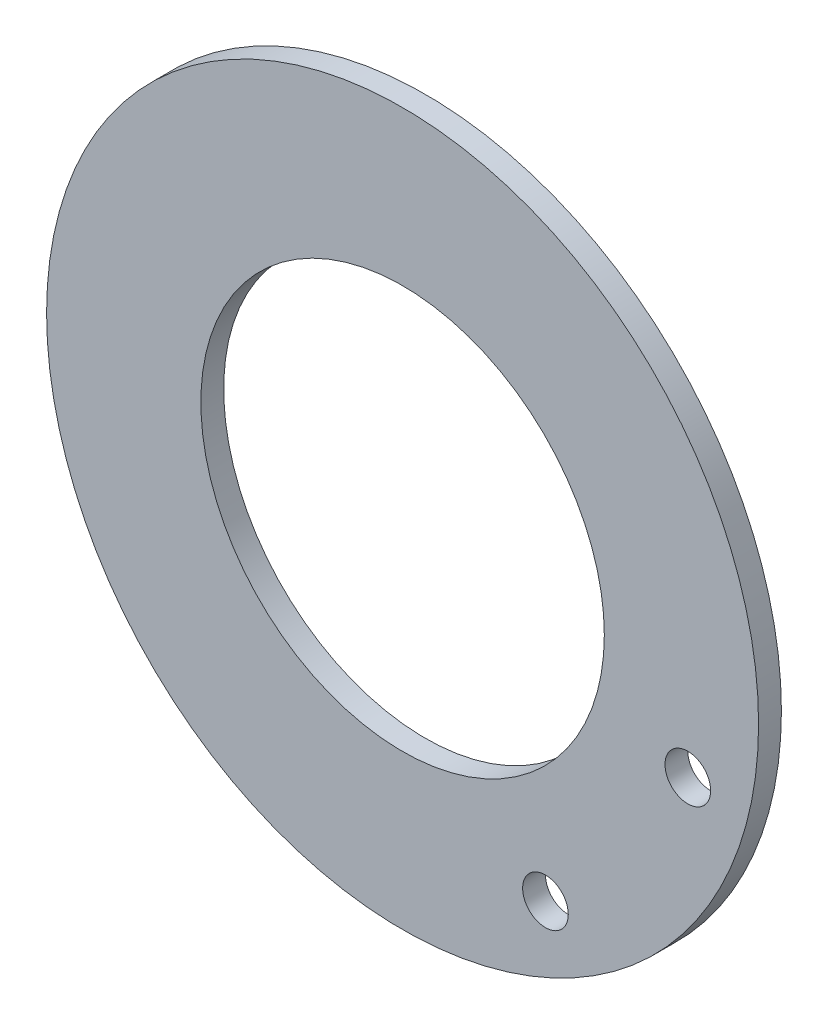
ISO-10303-21;
HEADER;
FILE_DESCRIPTION(('STEP AP214'),'2;1');
FILE_NAME('part.step','',(''),(''),'','','');
FILE_SCHEMA(('AUTOMOTIVE_DESIGN { 1 0 10303 214 1 1 1 1 }'));
ENDSEC;
DATA;
#1=APPLICATION_CONTEXT('core data for automotive mechanical design processes');
#2=APPLICATION_PROTOCOL_DEFINITION('international standard','automotive_design',2000,#1);
#3=PRODUCT_CONTEXT('',#1,'mechanical');
#4=PRODUCT('Part','Part','',(#3));
#5=PRODUCT_RELATED_PRODUCT_CATEGORY('part','',(#4));
#6=PRODUCT_DEFINITION_FORMATION('','',#4);
#7=PRODUCT_DEFINITION_CONTEXT('part definition',#1,'design');
#8=PRODUCT_DEFINITION('design','',#6,#7);
#9=PRODUCT_DEFINITION_SHAPE('','',#8);
#10=(LENGTH_UNIT() NAMED_UNIT(*) SI_UNIT(.MILLI.,.METRE.));
#11=(NAMED_UNIT(*) PLANE_ANGLE_UNIT() SI_UNIT($,.RADIAN.));
#12=(NAMED_UNIT(*) SI_UNIT($,.STERADIAN.) SOLID_ANGLE_UNIT());
#13=UNCERTAINTY_MEASURE_WITH_UNIT(LENGTH_MEASURE(1.E-05),#10,'distance_accuracy_value','');
#14=(GEOMETRIC_REPRESENTATION_CONTEXT(3) GLOBAL_UNCERTAINTY_ASSIGNED_CONTEXT((#13)) GLOBAL_UNIT_ASSIGNED_CONTEXT((#10,
#11,#12)) REPRESENTATION_CONTEXT('',''));
#15=CARTESIAN_POINT('',(0.,0.,0.));
#16=DIRECTION('',(0.,0.,1.));
#17=DIRECTION('',(1.,0.,0.));
#18=AXIS2_PLACEMENT_3D('',#15,#16,#17);
#19=CARTESIAN_POINT('',(0.,0.,3.175));
#20=DIRECTION('',(0.,0.,1.));
#21=DIRECTION('',(1.,0.,0.));
#22=AXIS2_PLACEMENT_3D('',#19,#20,#21);
#23=PLANE('',#22);
#24=CARTESIAN_POINT('',(19.8761613829909,-36.1740768185886,3.17499999999971));
#25=DIRECTION('',(0.,0.,1.));
#26=DIRECTION('',(1.,0.,0.));
#27=AXIS2_PLACEMENT_3D('',#24,#25,#26);
#28=CIRCLE('',#27,3.17499999999994);
#29=CARTESIAN_POINT('',(23.0511613829908,-36.1740768185886,3.17499999999971));
#30=VERTEX_POINT('',#29);
#31=EDGE_CURVE('E51',#30,#30,#28,.T.);
#32=ORIENTED_EDGE('',*,*,#31,.F.);
#33=EDGE_LOOP('',(#32));
#34=FACE_BOUND('',#33,.T.);
#35=CARTESIAN_POINT('',(39.6813752828784,-11.3584365411406,3.17499999999971));
#36=DIRECTION('',(0.,0.,1.));
#37=DIRECTION('',(1.,0.,0.));
#38=AXIS2_PLACEMENT_3D('',#35,#36,#37);
#39=CIRCLE('',#38,3.17499999999993);
#40=CARTESIAN_POINT('',(42.8563752828783,-11.3584365411406,3.17499999999971));
#41=VERTEX_POINT('',#40);
#42=EDGE_CURVE('E56',#41,#41,#39,.T.);
#43=ORIENTED_EDGE('',*,*,#42,.F.);
#44=EDGE_LOOP('',(#43));
#45=FACE_BOUND('',#44,.T.);
#46=CARTESIAN_POINT('',(0.,0.,3.175));
#47=DIRECTION('',(0.,0.,1.));
#48=DIRECTION('',(1.,0.,0.));
#49=AXIS2_PLACEMENT_3D('',#46,#47,#48);
#50=CIRCLE('',#49,49.53);
#51=CARTESIAN_POINT('',(49.53,0.,3.175));
#52=VERTEX_POINT('',#51);
#53=EDGE_CURVE('E10',#52,#52,#50,.T.);
#54=ORIENTED_EDGE('',*,*,#53,.T.);
#55=EDGE_LOOP('',(#54));
#56=FACE_BOUND('',#55,.T.);
#57=CARTESIAN_POINT('',(0.,0.,3.175));
#58=DIRECTION('',(0.,0.,1.));
#59=DIRECTION('',(1.,0.,0.));
#60=AXIS2_PLACEMENT_3D('',#57,#58,#59);
#61=CIRCLE('',#60,28.067);
#62=CARTESIAN_POINT('',(28.067,0.,3.175));
#63=VERTEX_POINT('',#62);
#64=EDGE_CURVE('E44',#63,#63,#61,.T.);
#65=ORIENTED_EDGE('',*,*,#64,.F.);
#66=EDGE_LOOP('',(#65));
#67=FACE_BOUND('',#66,.T.);
#68=ADVANCED_FACE('F31',(#34,#45,#56,#67),#23,.T.);
#69=CARTESIAN_POINT('',(0.,0.,0.));
#70=DIRECTION('',(0.,0.,1.));
#71=DIRECTION('',(1.,0.,0.));
#72=AXIS2_PLACEMENT_3D('',#69,#70,#71);
#73=PLANE('',#72);
#74=CARTESIAN_POINT('',(19.8761613829909,-36.1740768185886,0.));
#75=DIRECTION('',(0.,0.,1.));
#76=DIRECTION('',(1.,0.,0.));
#77=AXIS2_PLACEMENT_3D('',#74,#75,#76);
#78=CIRCLE('',#77,3.17499999999994);
#79=CARTESIAN_POINT('',(23.0511613829908,-36.1740768185886,0.));
#80=VERTEX_POINT('',#79);
#81=EDGE_CURVE('E35',#80,#80,#78,.T.);
#82=ORIENTED_EDGE('',*,*,#81,.T.);
#83=EDGE_LOOP('',(#82));
#84=FACE_BOUND('',#83,.T.);
#85=CARTESIAN_POINT('',(39.6813752828784,-11.3584365411406,0.));
#86=DIRECTION('',(0.,0.,1.));
#87=DIRECTION('',(1.,0.,0.));
#88=AXIS2_PLACEMENT_3D('',#85,#86,#87);
#89=CIRCLE('',#88,3.17499999999993);
#90=CARTESIAN_POINT('',(42.8563752828783,-11.3584365411406,0.));
#91=VERTEX_POINT('',#90);
#92=EDGE_CURVE('E49',#91,#91,#89,.T.);
#93=ORIENTED_EDGE('',*,*,#92,.T.);
#94=EDGE_LOOP('',(#93));
#95=FACE_BOUND('',#94,.T.);
#96=CARTESIAN_POINT('',(0.,0.,0.));
#97=DIRECTION('',(0.,0.,1.));
#98=DIRECTION('',(1.,0.,0.));
#99=AXIS2_PLACEMENT_3D('',#96,#97,#98);
#100=CIRCLE('',#99,49.53);
#101=CARTESIAN_POINT('',(49.53,0.,0.));
#102=VERTEX_POINT('',#101);
#103=EDGE_CURVE('E39',#102,#102,#100,.T.);
#104=ORIENTED_EDGE('',*,*,#103,.F.);
#105=EDGE_LOOP('',(#104));
#106=FACE_BOUND('',#105,.T.);
#107=CARTESIAN_POINT('',(0.,0.,0.));
#108=DIRECTION('',(0.,0.,1.));
#109=DIRECTION('',(1.,0.,0.));
#110=AXIS2_PLACEMENT_3D('',#107,#108,#109);
#111=CIRCLE('',#110,28.067);
#112=CARTESIAN_POINT('',(28.067,0.,0.));
#113=VERTEX_POINT('',#112);
#114=EDGE_CURVE('E47',#113,#113,#111,.T.);
#115=ORIENTED_EDGE('',*,*,#114,.T.);
#116=EDGE_LOOP('',(#115));
#117=FACE_BOUND('',#116,.T.);
#118=ADVANCED_FACE('F68',(#84,#95,#106,#117),#73,.F.);
#119=CARTESIAN_POINT('',(0.,0.,3.175));
#120=DIRECTION('',(0.,0.,-1.));
#121=DIRECTION('',(-1.,0.,0.));
#122=AXIS2_PLACEMENT_3D('',#119,#120,#121);
#123=CYLINDRICAL_SURFACE('',#122,49.53);
#124=ORIENTED_EDGE('',*,*,#53,.F.);
#125=EDGE_LOOP('',(#124));
#126=FACE_BOUND('',#125,.T.);
#127=ORIENTED_EDGE('',*,*,#103,.T.);
#128=EDGE_LOOP('',(#127));
#129=FACE_BOUND('',#128,.T.);
#130=ADVANCED_FACE('F33',(#126,#129),#123,.T.);
#131=CARTESIAN_POINT('',(0.,0.,3.175));
#132=DIRECTION('',(0.,0.,-1.));
#133=DIRECTION('',(-1.,0.,0.));
#134=AXIS2_PLACEMENT_3D('',#131,#132,#133);
#135=CYLINDRICAL_SURFACE('',#134,28.067);
#136=ORIENTED_EDGE('',*,*,#64,.T.);
#137=EDGE_LOOP('',(#136));
#138=FACE_BOUND('',#137,.T.);
#139=ORIENTED_EDGE('',*,*,#114,.F.);
#140=EDGE_LOOP('',(#139));
#141=FACE_BOUND('',#140,.T.);
#142=ADVANCED_FACE('F70',(#138,#141),#135,.F.);
#143=CARTESIAN_POINT('',(39.6813752828784,-11.3584365411406,-19.6850000000003));
#144=DIRECTION('',(0.,0.,1.));
#145=DIRECTION('',(1.,0.,0.));
#146=AXIS2_PLACEMENT_3D('',#143,#144,#145);
#147=CYLINDRICAL_SURFACE('',#146,3.17499999999993);
#148=CARTESIAN_POINT('',(42.8563752828783,-11.3584365411406,3.17499999999971));
#149=CARTESIAN_POINT('',(42.8563752828783,-11.3584365411406,3.14192708333305));
#150=CARTESIAN_POINT('',(42.8563752828783,-11.3584365411406,3.10885416666638));
#151=CARTESIAN_POINT('',(42.8563752828783,-11.3584365411406,3.04270833333306));
#152=CARTESIAN_POINT('',(42.8563752828783,-11.3584365411406,3.00963541666639));
#153=CARTESIAN_POINT('',(42.8563752828783,-11.3584365411406,2.94348958333306));
#154=CARTESIAN_POINT('',(42.8563752828783,-11.3584365411406,2.9104166666664));
#155=CARTESIAN_POINT('',(42.8563752828783,-11.3584365411406,2.84427083333307));
#156=CARTESIAN_POINT('',(42.8563752828783,-11.3584365411406,2.81119791666641));
#157=CARTESIAN_POINT('',(42.8563752828783,-11.3584365411406,2.74505208333308));
#158=CARTESIAN_POINT('',(42.8563752828783,-11.3584365411406,2.71197916666642));
#159=CARTESIAN_POINT('',(42.8563752828783,-11.3584365411406,2.64583333333309));
#160=CARTESIAN_POINT('',(42.8563752828783,-11.3584365411406,2.61276041666643));
#161=CARTESIAN_POINT('',(42.8563752828783,-11.3584365411406,2.5466145833331));
#162=CARTESIAN_POINT('',(42.8563752828783,-11.3584365411406,2.51354166666644));
#163=CARTESIAN_POINT('',(42.8563752828783,-11.3584365411406,2.44739583333311));
#164=CARTESIAN_POINT('',(42.8563752828783,-11.3584365411406,2.41432291666645));
#165=CARTESIAN_POINT('',(42.8563752828783,-11.3584365411406,2.34817708333312));
#166=CARTESIAN_POINT('',(42.8563752828783,-11.3584365411406,2.31510416666645));
#167=CARTESIAN_POINT('',(42.8563752828783,-11.3584365411406,2.24895833333313));
#168=CARTESIAN_POINT('',(42.8563752828783,-11.3584365411406,2.21588541666646));
#169=CARTESIAN_POINT('',(42.8563752828783,-11.3584365411406,2.14973958333313));
#170=CARTESIAN_POINT('',(42.8563752828783,-11.3584365411406,2.11666666666647));
#171=CARTESIAN_POINT('',(42.8563752828783,-11.3584365411406,2.05052083333314));
#172=CARTESIAN_POINT('',(42.8563752828783,-11.3584365411406,2.01744791666648));
#173=CARTESIAN_POINT('',(42.8563752828783,-11.3584365411406,1.95130208333315));
#174=CARTESIAN_POINT('',(42.8563752828783,-11.3584365411406,1.91822916666649));
#175=CARTESIAN_POINT('',(42.8563752828783,-11.3584365411406,1.85208333333316));
#176=CARTESIAN_POINT('',(42.8563752828783,-11.3584365411406,1.8190104166665));
#177=CARTESIAN_POINT('',(42.8563752828783,-11.3584365411406,1.75286458333317));
#178=CARTESIAN_POINT('',(42.8563752828783,-11.3584365411406,1.71979166666651));
#179=CARTESIAN_POINT('',(42.8563752828783,-11.3584365411406,1.65364583333318));
#180=CARTESIAN_POINT('',(42.8563752828783,-11.3584365411406,1.62057291666652));
#181=CARTESIAN_POINT('',(42.8563752828783,-11.3584365411406,1.55442708333319));
#182=CARTESIAN_POINT('',(42.8563752828783,-11.3584365411406,1.52135416666653));
#183=CARTESIAN_POINT('',(42.8563752828783,-11.3584365411406,1.4552083333332));
#184=CARTESIAN_POINT('',(42.8563752828783,-11.3584365411406,1.42213541666653));
#185=CARTESIAN_POINT('',(42.8563752828783,-11.3584365411406,1.35598958333321));
#186=CARTESIAN_POINT('',(42.8563752828783,-11.3584365411406,1.32291666666654));
#187=CARTESIAN_POINT('',(42.8563752828783,-11.3584365411406,1.25677083333322));
#188=CARTESIAN_POINT('',(42.8563752828783,-11.3584365411406,1.22369791666655));
#189=CARTESIAN_POINT('',(42.8563752828783,-11.3584365411406,1.15755208333323));
#190=CARTESIAN_POINT('',(42.8563752828783,-11.3584365411406,1.12447916666656));
#191=CARTESIAN_POINT('',(42.8563752828783,-11.3584365411406,1.05833333333324));
#192=CARTESIAN_POINT('',(42.8563752828783,-11.3584365411406,1.02526041666657));
#193=CARTESIAN_POINT('',(42.8563752828783,-11.3584365411406,0.959114583333243));
#194=CARTESIAN_POINT('',(42.8563752828783,-11.3584365411406,0.926041666666579));
#195=CARTESIAN_POINT('',(42.8563752828783,-11.3584365411406,0.85989583333325));
#196=CARTESIAN_POINT('',(42.8563752828783,-11.3584365411406,0.826822916666587));
#197=CARTESIAN_POINT('',(42.8563752828783,-11.3584365411406,0.760677083333259));
#198=CARTESIAN_POINT('',(42.8563752828783,-11.3584365411406,0.727604166666596));
#199=CARTESIAN_POINT('',(42.8563752828783,-11.3584365411406,0.661458333333269));
#200=CARTESIAN_POINT('',(42.8563752828783,-11.3584365411406,0.628385416666605));
#201=CARTESIAN_POINT('',(42.8563752828783,-11.3584365411406,0.562239583333278));
#202=CARTESIAN_POINT('',(42.8563752828783,-11.3584365411406,0.529166666666614));
#203=CARTESIAN_POINT('',(42.8563752828783,-11.3584365411406,0.463020833333287));
#204=CARTESIAN_POINT('',(42.8563752828783,-11.3584365411406,0.429947916666623));
#205=CARTESIAN_POINT('',(42.8563752828783,-11.3584365411406,0.363802083333296));
#206=CARTESIAN_POINT('',(42.8563752828783,-11.3584365411406,0.330729166666633));
#207=CARTESIAN_POINT('',(42.8563752828783,-11.3584365411406,0.264583333333305));
#208=CARTESIAN_POINT('',(42.8563752828783,-11.3584365411406,0.231510416666642));
#209=CARTESIAN_POINT('',(42.8563752828783,-11.3584365411406,0.165364583333315));
#210=CARTESIAN_POINT('',(42.8563752828783,-11.3584365411406,0.132291666666651));
#211=CARTESIAN_POINT('',(42.8563752828783,-11.3584365411406,0.0661458333333237));
#212=CARTESIAN_POINT('',(42.8563752828783,-11.3584365411406,0.0330729166666601));
#213=CARTESIAN_POINT('',(42.8563752828783,-11.3584365411406,0.));
#214=B_SPLINE_CURVE_WITH_KNOTS('',3,(#148,#149,#150,#151,#152,#153,#154,#155,#156,#157,#158,
#159,#160,#161,#162,#163,#164,#165,#166,#167,#168,#169,#170,#171,#172,#173,#174,#175,#176,#177,
#178,#179,#180,#181,#182,#183,#184,#185,#186,#187,#188,#189,#190,#191,#192,#193,#194,#195,#196,
#197,#198,#199,#200,#201,#202,#203,#204,#205,#206,#207,#208,#209,#210,#211,#212,#213),
.UNSPECIFIED.,.F.,.F.,(4,2,2,2,2,2,2,2,2,2,2,2,2,2,2,2,2,2,2,2,2,2,2,2,2,2,2,2,2,2,2,2,4),(0.,
0.0992187499999908,0.198437499999982,0.297656249999972,0.396874999999963,0.496093749999954,
0.595312499999945,0.694531249999936,0.793749999999926,0.892968749999921,0.992187499999912,
1.0914062499999,1.19062499999989,1.28984374999988,1.38906249999987,1.48828124999987,
1.58749999999986,1.68671874999985,1.78593749999984,1.88515624999983,1.98437499999982,
2.08359374999981,2.1828124999998,2.2820312499998,2.38124999999979,2.48046874999978,
2.57968749999977,2.67890624999976,2.77812499999975,2.87734374999974,2.97656249999973,
3.07578124999972,3.17499999999971),.UNSPECIFIED.);
#215=EDGE_CURVE('BSEAM72',#41,#91,#214,.T.);
#216=ORIENTED_EDGE('',*,*,#42,.T.);
#217=ORIENTED_EDGE('',*,*,#92,.F.);
#218=ORIENTED_EDGE('',*,*,#215,.T.);
#219=ORIENTED_EDGE('',*,*,#215,.F.);
#220=EDGE_LOOP('',(#216,#218,#217,#219));
#221=FACE_BOUND('',#220,.T.);
#222=ADVANCED_FACE('F72',(#221),#147,.F.);
#223=CARTESIAN_POINT('',(19.8761613829909,-36.1740768185886,-19.6850000000003));
#224=DIRECTION('',(0.,0.,1.));
#225=DIRECTION('',(1.,0.,0.));
#226=AXIS2_PLACEMENT_3D('',#223,#224,#225);
#227=CYLINDRICAL_SURFACE('',#226,3.17499999999994);
#228=CARTESIAN_POINT('',(23.0511613829908,-36.1740768185886,3.17499999999971));
#229=CARTESIAN_POINT('',(23.0511613829908,-36.1740768185886,3.14192708333305));
#230=CARTESIAN_POINT('',(23.0511613829908,-36.1740768185886,3.10885416666638));
#231=CARTESIAN_POINT('',(23.0511613829908,-36.1740768185886,3.04270833333306));
#232=CARTESIAN_POINT('',(23.0511613829908,-36.1740768185886,3.00963541666639));
#233=CARTESIAN_POINT('',(23.0511613829908,-36.1740768185886,2.94348958333306));
#234=CARTESIAN_POINT('',(23.0511613829908,-36.1740768185886,2.9104166666664));
#235=CARTESIAN_POINT('',(23.0511613829908,-36.1740768185886,2.84427083333307));
#236=CARTESIAN_POINT('',(23.0511613829908,-36.1740768185886,2.81119791666641));
#237=CARTESIAN_POINT('',(23.0511613829908,-36.1740768185886,2.74505208333308));
#238=CARTESIAN_POINT('',(23.0511613829908,-36.1740768185886,2.71197916666642));
#239=CARTESIAN_POINT('',(23.0511613829908,-36.1740768185886,2.64583333333309));
#240=CARTESIAN_POINT('',(23.0511613829908,-36.1740768185886,2.61276041666643));
#241=CARTESIAN_POINT('',(23.0511613829908,-36.1740768185886,2.5466145833331));
#242=CARTESIAN_POINT('',(23.0511613829908,-36.1740768185886,2.51354166666644));
#243=CARTESIAN_POINT('',(23.0511613829908,-36.1740768185886,2.44739583333311));
#244=CARTESIAN_POINT('',(23.0511613829908,-36.1740768185886,2.41432291666645));
#245=CARTESIAN_POINT('',(23.0511613829908,-36.1740768185886,2.34817708333312));
#246=CARTESIAN_POINT('',(23.0511613829908,-36.1740768185886,2.31510416666645));
#247=CARTESIAN_POINT('',(23.0511613829908,-36.1740768185886,2.24895833333313));
#248=CARTESIAN_POINT('',(23.0511613829908,-36.1740768185886,2.21588541666646));
#249=CARTESIAN_POINT('',(23.0511613829908,-36.1740768185886,2.14973958333313));
#250=CARTESIAN_POINT('',(23.0511613829908,-36.1740768185886,2.11666666666647));
#251=CARTESIAN_POINT('',(23.0511613829908,-36.1740768185886,2.05052083333314));
#252=CARTESIAN_POINT('',(23.0511613829908,-36.1740768185886,2.01744791666648));
#253=CARTESIAN_POINT('',(23.0511613829908,-36.1740768185886,1.95130208333315));
#254=CARTESIAN_POINT('',(23.0511613829908,-36.1740768185886,1.91822916666649));
#255=CARTESIAN_POINT('',(23.0511613829908,-36.1740768185886,1.85208333333316));
#256=CARTESIAN_POINT('',(23.0511613829908,-36.1740768185886,1.8190104166665));
#257=CARTESIAN_POINT('',(23.0511613829908,-36.1740768185886,1.75286458333317));
#258=CARTESIAN_POINT('',(23.0511613829908,-36.1740768185886,1.71979166666651));
#259=CARTESIAN_POINT('',(23.0511613829908,-36.1740768185886,1.65364583333318));
#260=CARTESIAN_POINT('',(23.0511613829908,-36.1740768185886,1.62057291666652));
#261=CARTESIAN_POINT('',(23.0511613829908,-36.1740768185886,1.55442708333319));
#262=CARTESIAN_POINT('',(23.0511613829908,-36.1740768185886,1.52135416666653));
#263=CARTESIAN_POINT('',(23.0511613829908,-36.1740768185886,1.4552083333332));
#264=CARTESIAN_POINT('',(23.0511613829908,-36.1740768185886,1.42213541666653));
#265=CARTESIAN_POINT('',(23.0511613829908,-36.1740768185886,1.35598958333321));
#266=CARTESIAN_POINT('',(23.0511613829908,-36.1740768185886,1.32291666666654));
#267=CARTESIAN_POINT('',(23.0511613829908,-36.1740768185886,1.25677083333322));
#268=CARTESIAN_POINT('',(23.0511613829908,-36.1740768185886,1.22369791666655));
#269=CARTESIAN_POINT('',(23.0511613829908,-36.1740768185886,1.15755208333323));
#270=CARTESIAN_POINT('',(23.0511613829908,-36.1740768185886,1.12447916666656));
#271=CARTESIAN_POINT('',(23.0511613829908,-36.1740768185886,1.05833333333324));
#272=CARTESIAN_POINT('',(23.0511613829908,-36.1740768185886,1.02526041666657));
#273=CARTESIAN_POINT('',(23.0511613829908,-36.1740768185886,0.959114583333243));
#274=CARTESIAN_POINT('',(23.0511613829908,-36.1740768185886,0.926041666666579));
#275=CARTESIAN_POINT('',(23.0511613829908,-36.1740768185886,0.85989583333325));
#276=CARTESIAN_POINT('',(23.0511613829908,-36.1740768185886,0.826822916666587));
#277=CARTESIAN_POINT('',(23.0511613829908,-36.1740768185886,0.760677083333259));
#278=CARTESIAN_POINT('',(23.0511613829908,-36.1740768185886,0.727604166666596));
#279=CARTESIAN_POINT('',(23.0511613829908,-36.1740768185886,0.661458333333269));
#280=CARTESIAN_POINT('',(23.0511613829908,-36.1740768185886,0.628385416666605));
#281=CARTESIAN_POINT('',(23.0511613829908,-36.1740768185886,0.562239583333278));
#282=CARTESIAN_POINT('',(23.0511613829908,-36.1740768185886,0.529166666666614));
#283=CARTESIAN_POINT('',(23.0511613829908,-36.1740768185886,0.463020833333287));
#284=CARTESIAN_POINT('',(23.0511613829908,-36.1740768185886,0.429947916666623));
#285=CARTESIAN_POINT('',(23.0511613829908,-36.1740768185886,0.363802083333296));
#286=CARTESIAN_POINT('',(23.0511613829908,-36.1740768185886,0.330729166666633));
#287=CARTESIAN_POINT('',(23.0511613829908,-36.1740768185886,0.264583333333305));
#288=CARTESIAN_POINT('',(23.0511613829908,-36.1740768185886,0.231510416666642));
#289=CARTESIAN_POINT('',(23.0511613829908,-36.1740768185886,0.165364583333315));
#290=CARTESIAN_POINT('',(23.0511613829908,-36.1740768185886,0.132291666666651));
#291=CARTESIAN_POINT('',(23.0511613829908,-36.1740768185886,0.0661458333333237));
#292=CARTESIAN_POINT('',(23.0511613829908,-36.1740768185886,0.0330729166666601));
#293=CARTESIAN_POINT('',(23.0511613829908,-36.1740768185886,0.));
#294=B_SPLINE_CURVE_WITH_KNOTS('',3,(#228,#229,#230,#231,#232,#233,#234,#235,#236,#237,#238,
#239,#240,#241,#242,#243,#244,#245,#246,#247,#248,#249,#250,#251,#252,#253,#254,#255,#256,#257,
#258,#259,#260,#261,#262,#263,#264,#265,#266,#267,#268,#269,#270,#271,#272,#273,#274,#275,#276,
#277,#278,#279,#280,#281,#282,#283,#284,#285,#286,#287,#288,#289,#290,#291,#292,#293),
.UNSPECIFIED.,.F.,.F.,(4,2,2,2,2,2,2,2,2,2,2,2,2,2,2,2,2,2,2,2,2,2,2,2,2,2,2,2,2,2,2,2,4),(0.,
0.0992187499999908,0.198437499999982,0.297656249999972,0.396874999999963,0.496093749999954,
0.595312499999945,0.694531249999936,0.793749999999926,0.892968749999921,0.992187499999912,
1.0914062499999,1.19062499999989,1.28984374999988,1.38906249999987,1.48828124999987,
1.58749999999986,1.68671874999985,1.78593749999984,1.88515624999983,1.98437499999982,
2.08359374999981,2.1828124999998,2.2820312499998,2.38124999999979,2.48046874999978,
2.57968749999977,2.67890624999976,2.77812499999975,2.87734374999974,2.97656249999973,
3.07578124999972,3.17499999999971),.UNSPECIFIED.);
#295=EDGE_CURVE('BSEAM78',#30,#80,#294,.T.);
#296=ORIENTED_EDGE('',*,*,#31,.T.);
#297=ORIENTED_EDGE('',*,*,#81,.F.);
#298=ORIENTED_EDGE('',*,*,#295,.T.);
#299=ORIENTED_EDGE('',*,*,#295,.F.);
#300=EDGE_LOOP('',(#296,#298,#297,#299));
#301=FACE_BOUND('',#300,.T.);
#302=ADVANCED_FACE('F78',(#301),#227,.F.);
#303=CLOSED_SHELL('',(#68,#118,#130,#142,#222,#302));
#304=MANIFOLD_SOLID_BREP('B2',#303);
#305=ADVANCED_BREP_SHAPE_REPRESENTATION('',(#18,#304),#14);
#306=SHAPE_DEFINITION_REPRESENTATION(#9,#305);
ENDSEC;
END-ISO-10303-21;
